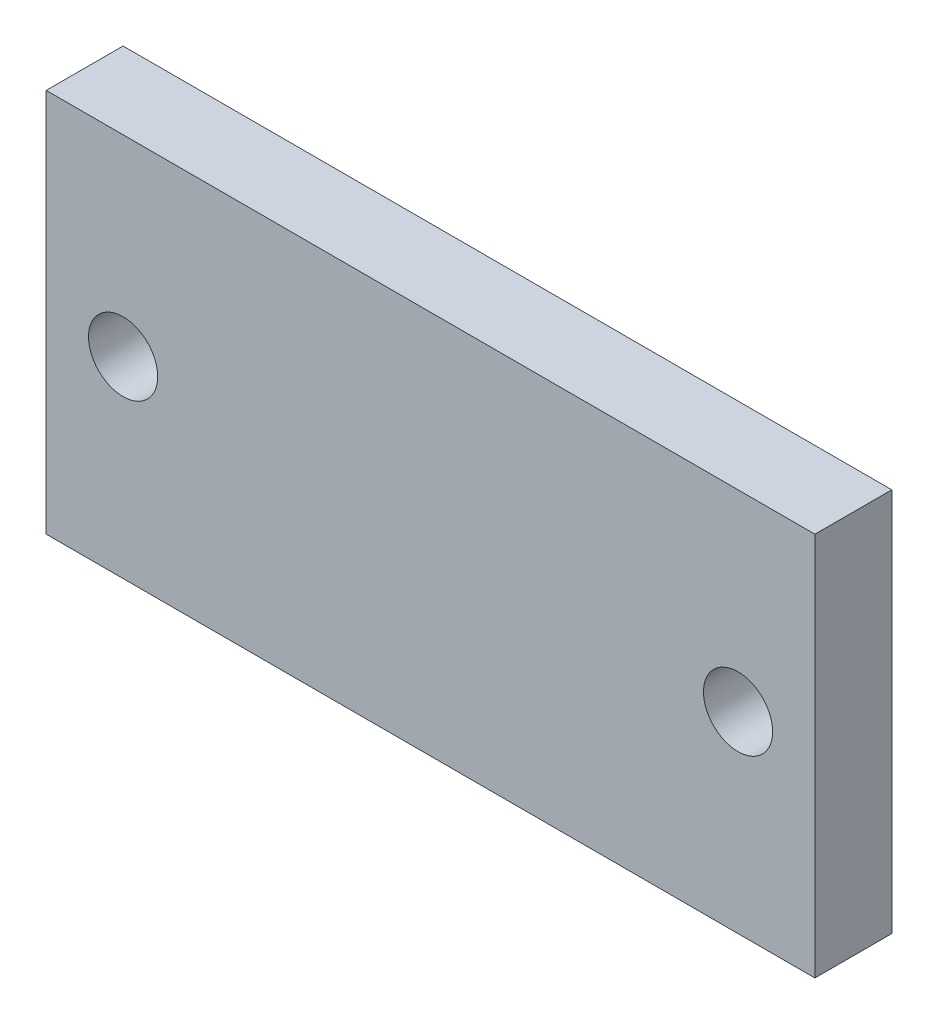
ISO-10303-21;
HEADER;
FILE_DESCRIPTION(('STEP AP214'),'2;1');
FILE_NAME('part.step','',(''),(''),'','','');
FILE_SCHEMA(('AUTOMOTIVE_DESIGN { 1 0 10303 214 1 1 1 1 }'));
ENDSEC;
DATA;
#1=APPLICATION_CONTEXT('core data for automotive mechanical design processes');
#2=APPLICATION_PROTOCOL_DEFINITION('international standard','automotive_design',2000,#1);
#3=PRODUCT_CONTEXT('',#1,'mechanical');
#4=PRODUCT('Part','Part','',(#3));
#5=PRODUCT_RELATED_PRODUCT_CATEGORY('part','',(#4));
#6=PRODUCT_DEFINITION_FORMATION('','',#4);
#7=PRODUCT_DEFINITION_CONTEXT('part definition',#1,'design');
#8=PRODUCT_DEFINITION('design','',#6,#7);
#9=PRODUCT_DEFINITION_SHAPE('','',#8);
#10=(LENGTH_UNIT() NAMED_UNIT(*) SI_UNIT(.MILLI.,.METRE.));
#11=(NAMED_UNIT(*) PLANE_ANGLE_UNIT() SI_UNIT($,.RADIAN.));
#12=(NAMED_UNIT(*) SI_UNIT($,.STERADIAN.) SOLID_ANGLE_UNIT());
#13=UNCERTAINTY_MEASURE_WITH_UNIT(LENGTH_MEASURE(1.E-05),#10,'distance_accuracy_value','');
#14=(GEOMETRIC_REPRESENTATION_CONTEXT(3) GLOBAL_UNCERTAINTY_ASSIGNED_CONTEXT((#13)) GLOBAL_UNIT_ASSIGNED_CONTEXT((#10,
#11,#12)) REPRESENTATION_CONTEXT('',''));
#15=CARTESIAN_POINT('',(0.,0.,0.));
#16=DIRECTION('',(0.,0.,1.));
#17=DIRECTION('',(1.,0.,0.));
#18=AXIS2_PLACEMENT_3D('',#15,#16,#17);
#19=CARTESIAN_POINT('',(0.,0.,5.));
#20=DIRECTION('',(0.,0.,-1.));
#21=DIRECTION('',(-1.,0.,0.));
#22=AXIS2_PLACEMENT_3D('',#19,#20,#21);
#23=PLANE('',#22);
#24=CARTESIAN_POINT('',(5.,12.5,5.));
#25=DIRECTION('',(0.,0.,1.));
#26=DIRECTION('',(1.,0.,0.));
#27=AXIS2_PLACEMENT_3D('',#24,#25,#26);
#28=CIRCLE('',#27,2.25);
#29=CARTESIAN_POINT('',(7.25,12.5,5.));
#30=VERTEX_POINT('',#29);
#31=EDGE_CURVE('E119',#30,#30,#28,.T.);
#32=ORIENTED_EDGE('',*,*,#31,.F.);
#33=EDGE_LOOP('',(#32));
#34=FACE_BOUND('',#33,.T.);
#35=DIRECTION('',(0.,-1.,0.));
#36=VECTOR('',#35,1.);
#37=CARTESIAN_POINT('',(0.,0.,5.));
#38=LINE('',#37,#36);
#39=CARTESIAN_POINT('',(0.,25.,5.));
#40=VERTEX_POINT('',#39);
#41=CARTESIAN_POINT('',(0.,0.,5.));
#42=VERTEX_POINT('',#41);
#43=EDGE_CURVE('E85',#40,#42,#38,.T.);
#44=ORIENTED_EDGE('',*,*,#43,.T.);
#45=DIRECTION('',(1.,0.,0.));
#46=VECTOR('',#45,1.);
#47=CARTESIAN_POINT('',(0.,0.,5.));
#48=LINE('',#47,#46);
#49=CARTESIAN_POINT('',(50.,0.,5.));
#50=VERTEX_POINT('',#49);
#51=EDGE_CURVE('E80',#42,#50,#48,.T.);
#52=ORIENTED_EDGE('',*,*,#51,.T.);
#53=DIRECTION('',(0.,1.,0.));
#54=VECTOR('',#53,1.);
#55=CARTESIAN_POINT('',(50.,0.,5.));
#56=LINE('',#55,#54);
#57=CARTESIAN_POINT('',(50.,25.,5.));
#58=VERTEX_POINT('',#57);
#59=EDGE_CURVE('E83',#50,#58,#56,.T.);
#60=ORIENTED_EDGE('',*,*,#59,.T.);
#61=DIRECTION('',(-1.,0.,0.));
#62=VECTOR('',#61,1.);
#63=CARTESIAN_POINT('',(0.,25.,5.));
#64=LINE('',#63,#62);
#65=EDGE_CURVE('E50',#58,#40,#64,.T.);
#66=ORIENTED_EDGE('',*,*,#65,.T.);
#67=EDGE_LOOP('',(#44,#52,#60,#66));
#68=FACE_BOUND('',#67,.T.);
#69=CARTESIAN_POINT('',(45.,12.5,5.));
#70=DIRECTION('',(0.,0.,1.));
#71=DIRECTION('',(1.,0.,0.));
#72=AXIS2_PLACEMENT_3D('',#69,#70,#71);
#73=CIRCLE('',#72,2.25);
#74=CARTESIAN_POINT('',(47.25,12.5,5.));
#75=VERTEX_POINT('',#74);
#76=EDGE_CURVE('E113',#75,#75,#73,.T.);
#77=ORIENTED_EDGE('',*,*,#76,.F.);
#78=EDGE_LOOP('',(#77));
#79=FACE_BOUND('',#78,.T.);
#80=ADVANCED_FACE('F33',(#34,#68,#79),#23,.F.);
#81=CARTESIAN_POINT('',(0.,0.,5.));
#82=DIRECTION('',(1.,0.,0.));
#83=DIRECTION('',(0.,0.,-1.));
#84=AXIS2_PLACEMENT_3D('',#81,#82,#83);
#85=PLANE('',#84);
#86=DIRECTION('',(0.,-1.,0.));
#87=VECTOR('',#86,1.);
#88=CARTESIAN_POINT('',(0.,0.,0.));
#89=LINE('',#88,#87);
#90=CARTESIAN_POINT('',(0.,25.,0.));
#91=VERTEX_POINT('',#90);
#92=CARTESIAN_POINT('',(0.,0.,0.));
#93=VERTEX_POINT('',#92);
#94=EDGE_CURVE('E97',#91,#93,#89,.T.);
#95=ORIENTED_EDGE('',*,*,#94,.T.);
#96=DIRECTION('',(0.,0.,-1.));
#97=VECTOR('',#96,1.);
#98=CARTESIAN_POINT('',(0.,0.,5.));
#99=LINE('',#98,#97);
#100=EDGE_CURVE('E11',#42,#93,#99,.T.);
#101=ORIENTED_EDGE('',*,*,#100,.F.);
#102=ORIENTED_EDGE('',*,*,#43,.F.);
#103=DIRECTION('',(0.,0.,-1.));
#104=VECTOR('',#103,1.);
#105=CARTESIAN_POINT('',(0.,25.,5.));
#106=LINE('',#105,#104);
#107=EDGE_CURVE('E93',#40,#91,#106,.T.);
#108=ORIENTED_EDGE('',*,*,#107,.T.);
#109=EDGE_LOOP('',(#95,#101,#102,#108));
#110=FACE_BOUND('',#109,.T.);
#111=ADVANCED_FACE('F35',(#110),#85,.F.);
#112=CARTESIAN_POINT('',(0.,0.,5.));
#113=DIRECTION('',(0.,1.,0.));
#114=DIRECTION('',(0.,0.,1.));
#115=AXIS2_PLACEMENT_3D('',#112,#113,#114);
#116=PLANE('',#115);
#117=DIRECTION('',(1.,0.,0.));
#118=VECTOR('',#117,1.);
#119=CARTESIAN_POINT('',(0.,0.,0.));
#120=LINE('',#119,#118);
#121=CARTESIAN_POINT('',(50.,0.,0.));
#122=VERTEX_POINT('',#121);
#123=EDGE_CURVE('E89',#93,#122,#120,.T.);
#124=ORIENTED_EDGE('',*,*,#123,.T.);
#125=DIRECTION('',(0.,0.,-1.));
#126=VECTOR('',#125,1.);
#127=CARTESIAN_POINT('',(50.,0.,5.));
#128=LINE('',#127,#126);
#129=EDGE_CURVE('E42',#50,#122,#128,.T.);
#130=ORIENTED_EDGE('',*,*,#129,.F.);
#131=ORIENTED_EDGE('',*,*,#51,.F.);
#132=ORIENTED_EDGE('',*,*,#100,.T.);
#133=EDGE_LOOP('',(#124,#130,#131,#132));
#134=FACE_BOUND('',#133,.T.);
#135=ADVANCED_FACE('F88',(#134),#116,.F.);
#136=CARTESIAN_POINT('',(50.,0.,5.));
#137=DIRECTION('',(-1.,0.,0.));
#138=DIRECTION('',(0.,0.,1.));
#139=AXIS2_PLACEMENT_3D('',#136,#137,#138);
#140=PLANE('',#139);
#141=DIRECTION('',(0.,1.,0.));
#142=VECTOR('',#141,1.);
#143=CARTESIAN_POINT('',(50.,0.,0.));
#144=LINE('',#143,#142);
#145=CARTESIAN_POINT('',(50.,25.,0.));
#146=VERTEX_POINT('',#145);
#147=EDGE_CURVE('E67',#122,#146,#144,.T.);
#148=ORIENTED_EDGE('',*,*,#147,.T.);
#149=DIRECTION('',(0.,0.,-1.));
#150=VECTOR('',#149,1.);
#151=CARTESIAN_POINT('',(50.,25.,5.));
#152=LINE('',#151,#150);
#153=EDGE_CURVE('E90',#58,#146,#152,.T.);
#154=ORIENTED_EDGE('',*,*,#153,.F.);
#155=ORIENTED_EDGE('',*,*,#59,.F.);
#156=ORIENTED_EDGE('',*,*,#129,.T.);
#157=EDGE_LOOP('',(#148,#154,#155,#156));
#158=FACE_BOUND('',#157,.T.);
#159=ADVANCED_FACE('F91',(#158),#140,.F.);
#160=CARTESIAN_POINT('',(0.,25.,5.));
#161=DIRECTION('',(0.,-1.,0.));
#162=DIRECTION('',(0.,0.,-1.));
#163=AXIS2_PLACEMENT_3D('',#160,#161,#162);
#164=PLANE('',#163);
#165=DIRECTION('',(-1.,0.,0.));
#166=VECTOR('',#165,1.);
#167=CARTESIAN_POINT('',(0.,25.,0.));
#168=LINE('',#167,#166);
#169=EDGE_CURVE('E73',#146,#91,#168,.T.);
#170=ORIENTED_EDGE('',*,*,#169,.T.);
#171=ORIENTED_EDGE('',*,*,#107,.F.);
#172=ORIENTED_EDGE('',*,*,#65,.F.);
#173=ORIENTED_EDGE('',*,*,#153,.T.);
#174=EDGE_LOOP('',(#170,#171,#172,#173));
#175=FACE_BOUND('',#174,.T.);
#176=ADVANCED_FACE('F105',(#175),#164,.F.);
#177=CARTESIAN_POINT('',(0.,0.,0.));
#178=DIRECTION('',(0.,0.,-1.));
#179=DIRECTION('',(-1.,0.,0.));
#180=AXIS2_PLACEMENT_3D('',#177,#178,#179);
#181=PLANE('',#180);
#182=CARTESIAN_POINT('',(5.,12.5,0.));
#183=DIRECTION('',(0.,0.,-1.));
#184=DIRECTION('',(-1.,0.,0.));
#185=AXIS2_PLACEMENT_3D('',#182,#183,#184);
#186=CIRCLE('',#185,2.25);
#187=CARTESIAN_POINT('',(2.75,12.5,0.));
#188=VERTEX_POINT('',#187);
#189=EDGE_CURVE('E116',#188,#188,#186,.T.);
#190=ORIENTED_EDGE('',*,*,#189,.F.);
#191=EDGE_LOOP('',(#190));
#192=FACE_BOUND('',#191,.T.);
#193=CARTESIAN_POINT('',(45.,12.5,0.));
#194=DIRECTION('',(0.,0.,-1.));
#195=DIRECTION('',(-1.,0.,0.));
#196=AXIS2_PLACEMENT_3D('',#193,#194,#195);
#197=CIRCLE('',#196,2.25);
#198=CARTESIAN_POINT('',(42.75,12.5,0.));
#199=VERTEX_POINT('',#198);
#200=EDGE_CURVE('E100',#199,#199,#197,.T.);
#201=ORIENTED_EDGE('',*,*,#200,.F.);
#202=EDGE_LOOP('',(#201));
#203=FACE_BOUND('',#202,.T.);
#204=ORIENTED_EDGE('',*,*,#94,.F.);
#205=ORIENTED_EDGE('',*,*,#169,.F.);
#206=ORIENTED_EDGE('',*,*,#147,.F.);
#207=ORIENTED_EDGE('',*,*,#123,.F.);
#208=EDGE_LOOP('',(#204,#205,#206,#207));
#209=FACE_BOUND('',#208,.T.);
#210=ADVANCED_FACE('F108',(#192,#203,#209),#181,.T.);
#211=CARTESIAN_POINT('',(45.,12.5,5.));
#212=DIRECTION('',(0.,0.,1.));
#213=DIRECTION('',(1.,0.,0.));
#214=AXIS2_PLACEMENT_3D('',#211,#212,#213);
#215=CYLINDRICAL_SURFACE('',#214,2.25);
#216=ORIENTED_EDGE('',*,*,#76,.T.);
#217=EDGE_LOOP('',(#216));
#218=FACE_BOUND('',#217,.T.);
#219=ORIENTED_EDGE('',*,*,#200,.T.);
#220=EDGE_LOOP('',(#219));
#221=FACE_BOUND('',#220,.T.);
#222=ADVANCED_FACE('F133',(#218,#221),#215,.F.);
#223=CARTESIAN_POINT('',(5.,12.5,5.));
#224=DIRECTION('',(0.,0.,1.));
#225=DIRECTION('',(1.,0.,0.));
#226=AXIS2_PLACEMENT_3D('',#223,#224,#225);
#227=CYLINDRICAL_SURFACE('',#226,2.25);
#228=ORIENTED_EDGE('',*,*,#31,.T.);
#229=EDGE_LOOP('',(#228));
#230=FACE_BOUND('',#229,.T.);
#231=ORIENTED_EDGE('',*,*,#189,.T.);
#232=EDGE_LOOP('',(#231));
#233=FACE_BOUND('',#232,.T.);
#234=ADVANCED_FACE('F123',(#230,#233),#227,.F.);
#235=CLOSED_SHELL('',(#80,#111,#135,#159,#176,#210,#222,#234));
#236=MANIFOLD_SOLID_BREP('B2',#235);
#237=ADVANCED_BREP_SHAPE_REPRESENTATION('',(#18,#236),#14);
#238=SHAPE_DEFINITION_REPRESENTATION(#9,#237);
ENDSEC;
END-ISO-10303-21;
